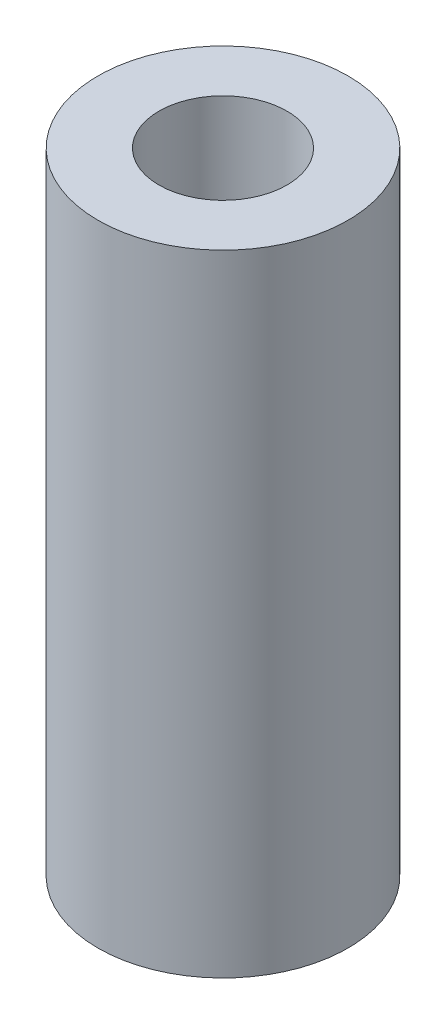
ISO-10303-21;
HEADER;
FILE_DESCRIPTION(('STEP AP214'),'2;1');
FILE_NAME('part.step','',(''),(''),'','','');
FILE_SCHEMA(('AUTOMOTIVE_DESIGN { 1 0 10303 214 1 1 1 1 }'));
ENDSEC;
DATA;
#1=APPLICATION_CONTEXT('core data for automotive mechanical design processes');
#2=APPLICATION_PROTOCOL_DEFINITION('international standard','automotive_design',2000,#1);
#3=PRODUCT_CONTEXT('',#1,'mechanical');
#4=PRODUCT('Part','Part','',(#3));
#5=PRODUCT_RELATED_PRODUCT_CATEGORY('part','',(#4));
#6=PRODUCT_DEFINITION_FORMATION('','',#4);
#7=PRODUCT_DEFINITION_CONTEXT('part definition',#1,'design');
#8=PRODUCT_DEFINITION('design','',#6,#7);
#9=PRODUCT_DEFINITION_SHAPE('','',#8);
#10=(LENGTH_UNIT() NAMED_UNIT(*) SI_UNIT(.MILLI.,.METRE.));
#11=(NAMED_UNIT(*) PLANE_ANGLE_UNIT() SI_UNIT($,.RADIAN.));
#12=(NAMED_UNIT(*) SI_UNIT($,.STERADIAN.) SOLID_ANGLE_UNIT());
#13=UNCERTAINTY_MEASURE_WITH_UNIT(LENGTH_MEASURE(1.E-05),#10,'distance_accuracy_value','');
#14=(GEOMETRIC_REPRESENTATION_CONTEXT(3) GLOBAL_UNCERTAINTY_ASSIGNED_CONTEXT((#13)) GLOBAL_UNIT_ASSIGNED_CONTEXT((#10,
#11,#12)) REPRESENTATION_CONTEXT('',''));
#15=CARTESIAN_POINT('',(0.,0.,0.));
#16=DIRECTION('',(0.,0.,1.));
#17=DIRECTION('',(1.,0.,0.));
#18=AXIS2_PLACEMENT_3D('',#15,#16,#17);
#19=CARTESIAN_POINT('',(0.,15.5,0.));
#20=DIRECTION('',(0.,1.,0.));
#21=DIRECTION('',(0.,0.,1.));
#22=AXIS2_PLACEMENT_3D('',#19,#20,#21);
#23=PLANE('',#22);
#24=CARTESIAN_POINT('',(0.,15.5,0.));
#25=DIRECTION('',(0.,1.,0.));
#26=DIRECTION('',(0.,0.,1.));
#27=AXIS2_PLACEMENT_3D('',#24,#25,#26);
#28=CIRCLE('',#27,3.075);
#29=CARTESIAN_POINT('',(0.,15.5,3.075));
#30=VERTEX_POINT('',#29);
#31=EDGE_CURVE('E10',#30,#30,#28,.T.);
#32=ORIENTED_EDGE('',*,*,#31,.T.);
#33=EDGE_LOOP('',(#32));
#34=FACE_BOUND('',#33,.T.);
#35=CARTESIAN_POINT('',(0.,15.5,0.));
#36=DIRECTION('',(0.,1.,0.));
#37=DIRECTION('',(0.,0.,1.));
#38=AXIS2_PLACEMENT_3D('',#35,#36,#37);
#39=CIRCLE('',#38,1.575);
#40=CARTESIAN_POINT('',(0.,15.5,1.575));
#41=VERTEX_POINT('',#40);
#42=EDGE_CURVE('E50',#41,#41,#39,.T.);
#43=ORIENTED_EDGE('',*,*,#42,.F.);
#44=EDGE_LOOP('',(#43));
#45=FACE_BOUND('',#44,.T.);
#46=ADVANCED_FACE('F37',(#34,#45),#23,.T.);
#47=CARTESIAN_POINT('',(0.,0.,0.));
#48=DIRECTION('',(0.,1.,0.));
#49=DIRECTION('',(0.,0.,1.));
#50=AXIS2_PLACEMENT_3D('',#47,#48,#49);
#51=PLANE('',#50);
#52=CARTESIAN_POINT('',(0.,0.,0.));
#53=DIRECTION('',(0.,1.,0.));
#54=DIRECTION('',(0.,0.,1.));
#55=AXIS2_PLACEMENT_3D('',#52,#53,#54);
#56=CIRCLE('',#55,3.075);
#57=CARTESIAN_POINT('',(0.,0.,3.075));
#58=VERTEX_POINT('',#57);
#59=EDGE_CURVE('E41',#58,#58,#56,.T.);
#60=ORIENTED_EDGE('',*,*,#59,.F.);
#61=EDGE_LOOP('',(#60));
#62=FACE_BOUND('',#61,.T.);
#63=CARTESIAN_POINT('',(0.,0.,0.));
#64=DIRECTION('',(0.,1.,0.));
#65=DIRECTION('',(0.,0.,1.));
#66=AXIS2_PLACEMENT_3D('',#63,#64,#65);
#67=CIRCLE('',#66,1.575);
#68=CARTESIAN_POINT('',(0.,0.,1.575));
#69=VERTEX_POINT('',#68);
#70=EDGE_CURVE('E52',#69,#69,#67,.T.);
#71=ORIENTED_EDGE('',*,*,#70,.T.);
#72=EDGE_LOOP('',(#71));
#73=FACE_BOUND('',#72,.T.);
#74=ADVANCED_FACE('F64',(#62,#73),#51,.F.);
#75=CARTESIAN_POINT('',(0.,15.5,0.));
#76=DIRECTION('',(0.,-1.,0.));
#77=DIRECTION('',(0.,0.,-1.));
#78=AXIS2_PLACEMENT_3D('',#75,#76,#77);
#79=CYLINDRICAL_SURFACE('',#78,3.075);
#80=ORIENTED_EDGE('',*,*,#31,.F.);
#81=EDGE_LOOP('',(#80));
#82=FACE_BOUND('',#81,.T.);
#83=ORIENTED_EDGE('',*,*,#59,.T.);
#84=EDGE_LOOP('',(#83));
#85=FACE_BOUND('',#84,.T.);
#86=ADVANCED_FACE('F39',(#82,#85),#79,.T.);
#87=CARTESIAN_POINT('',(0.,15.5,0.));
#88=DIRECTION('',(0.,-1.,0.));
#89=DIRECTION('',(0.,0.,-1.));
#90=AXIS2_PLACEMENT_3D('',#87,#88,#89);
#91=CYLINDRICAL_SURFACE('',#90,1.575);
#92=ORIENTED_EDGE('',*,*,#42,.T.);
#93=EDGE_LOOP('',(#92));
#94=FACE_BOUND('',#93,.T.);
#95=ORIENTED_EDGE('',*,*,#70,.F.);
#96=EDGE_LOOP('',(#95));
#97=FACE_BOUND('',#96,.T.);
#98=ADVANCED_FACE('F60',(#94,#97),#91,.F.);
#99=CLOSED_SHELL('',(#46,#74,#86,#98));
#100=MANIFOLD_SOLID_BREP('B2',#99);
#101=ADVANCED_BREP_SHAPE_REPRESENTATION('',(#18,#100),#14);
#102=SHAPE_DEFINITION_REPRESENTATION(#9,#101);
ENDSEC;
END-ISO-10303-21;
